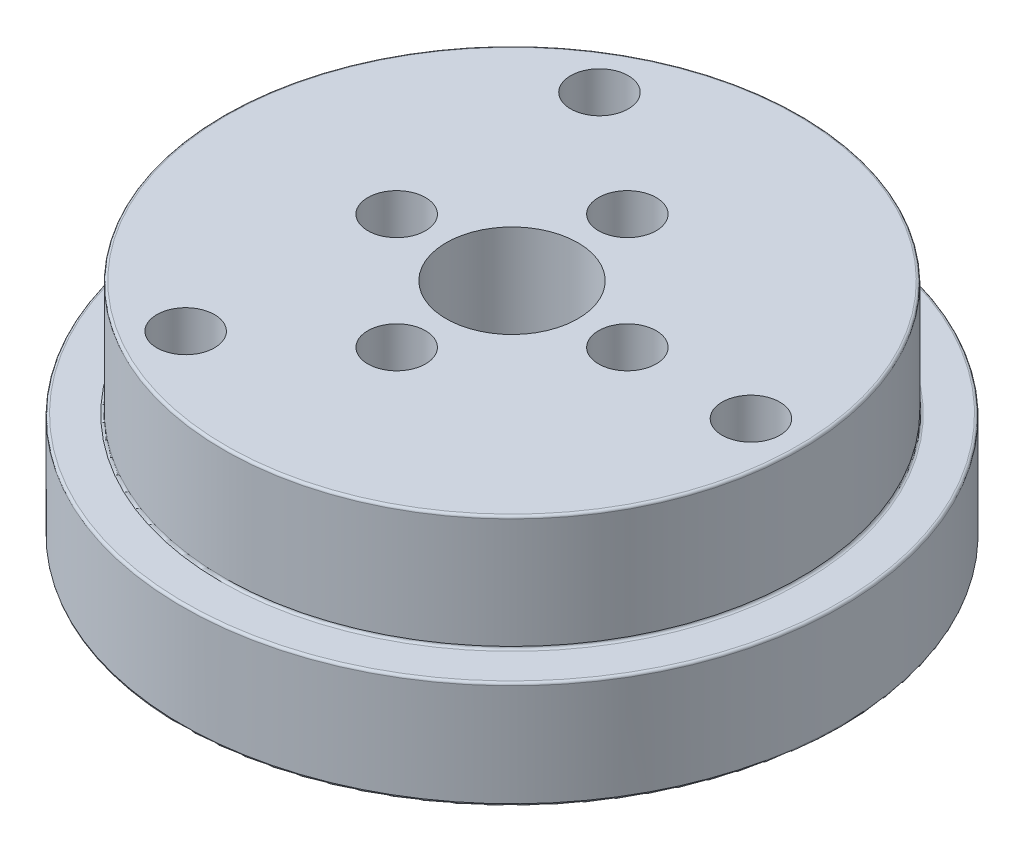
ISO-10303-21;
HEADER;
FILE_DESCRIPTION(('STEP AP214'),'2;1');
FILE_NAME('part.step','',(''),(''),'','','');
FILE_SCHEMA(('AUTOMOTIVE_DESIGN { 1 0 10303 214 1 1 1 1 }'));
ENDSEC;
DATA;
#1=APPLICATION_CONTEXT('core data for automotive mechanical design processes');
#2=APPLICATION_PROTOCOL_DEFINITION('international standard','automotive_design',2000,#1);
#3=PRODUCT_CONTEXT('',#1,'mechanical');
#4=PRODUCT('Part','Part','',(#3));
#5=PRODUCT_RELATED_PRODUCT_CATEGORY('part','',(#4));
#6=PRODUCT_DEFINITION_FORMATION('','',#4);
#7=PRODUCT_DEFINITION_CONTEXT('part definition',#1,'design');
#8=PRODUCT_DEFINITION('design','',#6,#7);
#9=PRODUCT_DEFINITION_SHAPE('','',#8);
#10=(LENGTH_UNIT() NAMED_UNIT(*) SI_UNIT(.MILLI.,.METRE.));
#11=(NAMED_UNIT(*) PLANE_ANGLE_UNIT() SI_UNIT($,.RADIAN.));
#12=(NAMED_UNIT(*) SI_UNIT($,.STERADIAN.) SOLID_ANGLE_UNIT());
#13=UNCERTAINTY_MEASURE_WITH_UNIT(LENGTH_MEASURE(1.E-05),#10,'distance_accuracy_value','');
#14=(GEOMETRIC_REPRESENTATION_CONTEXT(3) GLOBAL_UNCERTAINTY_ASSIGNED_CONTEXT((#13)) GLOBAL_UNIT_ASSIGNED_CONTEXT((#10,
#11,#12)) REPRESENTATION_CONTEXT('',''));
#15=CARTESIAN_POINT('',(0.,0.,0.));
#16=DIRECTION('',(0.,0.,1.));
#17=DIRECTION('',(1.,0.,0.));
#18=AXIS2_PLACEMENT_3D('',#15,#16,#17);
#19=CARTESIAN_POINT('',(0.,13.5,-7.));
#20=DIRECTION('',(0.,-1.,0.));
#21=DIRECTION('',(0.,0.,-1.));
#22=AXIS2_PLACEMENT_3D('',#19,#20,#21);
#23=CYLINDRICAL_SURFACE('',#22,1.75);
#24=CARTESIAN_POINT('',(0.,13.5,-7.));
#25=DIRECTION('',(0.,-1.,0.));
#26=DIRECTION('',(0.,0.,-1.));
#27=AXIS2_PLACEMENT_3D('',#24,#25,#26);
#28=CIRCLE('',#27,1.75);
#29=CARTESIAN_POINT('',(0.,13.5,-8.75));
#30=VERTEX_POINT('',#29);
#31=EDGE_CURVE('E83',#30,#30,#28,.T.);
#32=ORIENTED_EDGE('',*,*,#31,.F.);
#33=EDGE_LOOP('',(#32));
#34=FACE_BOUND('',#33,.T.);
#35=CARTESIAN_POINT('',(0.,7.5,-7.));
#36=DIRECTION('',(0.,-1.,0.));
#37=DIRECTION('',(0.,0.,-1.));
#38=AXIS2_PLACEMENT_3D('',#35,#36,#37);
#39=CIRCLE('',#38,1.75);
#40=CARTESIAN_POINT('',(0.,7.5,-8.75));
#41=VERTEX_POINT('',#40);
#42=EDGE_CURVE('E97',#41,#41,#39,.F.);
#43=ORIENTED_EDGE('',*,*,#42,.F.);
#44=EDGE_LOOP('',(#43));
#45=FACE_BOUND('',#44,.T.);
#46=ADVANCED_FACE('F31',(#34,#45),#23,.F.);
#47=CARTESIAN_POINT('',(7.,13.5,0.));
#48=DIRECTION('',(0.,-1.,0.));
#49=DIRECTION('',(0.,0.,-1.));
#50=AXIS2_PLACEMENT_3D('',#47,#48,#49);
#51=CYLINDRICAL_SURFACE('',#50,1.75);
#52=CARTESIAN_POINT('',(7.,13.5,0.));
#53=DIRECTION('',(0.,-1.,0.));
#54=DIRECTION('',(0.,0.,-1.));
#55=AXIS2_PLACEMENT_3D('',#52,#53,#54);
#56=CIRCLE('',#55,1.75);
#57=CARTESIAN_POINT('',(7.,13.5,-1.75));
#58=VERTEX_POINT('',#57);
#59=EDGE_CURVE('E73',#58,#58,#56,.T.);
#60=ORIENTED_EDGE('',*,*,#59,.F.);
#61=EDGE_LOOP('',(#60));
#62=FACE_BOUND('',#61,.T.);
#63=CARTESIAN_POINT('',(7.,7.5,0.));
#64=DIRECTION('',(0.,-1.,0.));
#65=DIRECTION('',(0.,0.,-1.));
#66=AXIS2_PLACEMENT_3D('',#63,#64,#65);
#67=CIRCLE('',#66,1.75);
#68=CARTESIAN_POINT('',(7.,7.5,-1.75));
#69=VERTEX_POINT('',#68);
#70=EDGE_CURVE('E104',#69,#69,#67,.F.);
#71=ORIENTED_EDGE('',*,*,#70,.F.);
#72=EDGE_LOOP('',(#71));
#73=FACE_BOUND('',#72,.T.);
#74=ADVANCED_FACE('F159',(#62,#73),#51,.F.);
#75=CARTESIAN_POINT('',(0.,13.5,0.));
#76=DIRECTION('',(0.,-1.,0.));
#77=DIRECTION('',(0.,0.,-1.));
#78=AXIS2_PLACEMENT_3D('',#75,#76,#77);
#79=CYLINDRICAL_SURFACE('',#78,4.);
#80=CARTESIAN_POINT('',(0.,13.5,0.));
#81=DIRECTION('',(0.,-1.,0.));
#82=DIRECTION('',(0.,0.,-1.));
#83=AXIS2_PLACEMENT_3D('',#80,#81,#82);
#84=CIRCLE('',#83,4.);
#85=CARTESIAN_POINT('',(0.,13.5,-4.));
#86=VERTEX_POINT('',#85);
#87=EDGE_CURVE('E92',#86,#86,#84,.T.);
#88=ORIENTED_EDGE('',*,*,#87,.F.);
#89=EDGE_LOOP('',(#88));
#90=FACE_BOUND('',#89,.T.);
#91=CARTESIAN_POINT('',(0.,7.5,0.));
#92=DIRECTION('',(0.,-1.,0.));
#93=DIRECTION('',(0.,0.,-1.));
#94=AXIS2_PLACEMENT_3D('',#91,#92,#93);
#95=CIRCLE('',#94,4.);
#96=CARTESIAN_POINT('',(0.,7.5,-4.));
#97=VERTEX_POINT('',#96);
#98=EDGE_CURVE('E107',#97,#97,#95,.F.);
#99=ORIENTED_EDGE('',*,*,#98,.F.);
#100=EDGE_LOOP('',(#99));
#101=FACE_BOUND('',#100,.T.);
#102=ADVANCED_FACE('F165',(#90,#101),#79,.F.);
#103=CARTESIAN_POINT('',(0.,13.5,7.));
#104=DIRECTION('',(0.,-1.,0.));
#105=DIRECTION('',(0.,0.,-1.));
#106=AXIS2_PLACEMENT_3D('',#103,#104,#105);
#107=CYLINDRICAL_SURFACE('',#106,1.75);
#108=CARTESIAN_POINT('',(0.,13.5,7.));
#109=DIRECTION('',(0.,-1.,0.));
#110=DIRECTION('',(0.,0.,-1.));
#111=AXIS2_PLACEMENT_3D('',#108,#109,#110);
#112=CIRCLE('',#111,1.75);
#113=CARTESIAN_POINT('',(0.,13.5,5.25));
#114=VERTEX_POINT('',#113);
#115=EDGE_CURVE('E89',#114,#114,#112,.T.);
#116=ORIENTED_EDGE('',*,*,#115,.F.);
#117=EDGE_LOOP('',(#116));
#118=FACE_BOUND('',#117,.T.);
#119=CARTESIAN_POINT('',(0.,7.5,7.));
#120=DIRECTION('',(0.,-1.,0.));
#121=DIRECTION('',(0.,0.,-1.));
#122=AXIS2_PLACEMENT_3D('',#119,#120,#121);
#123=CIRCLE('',#122,1.75);
#124=CARTESIAN_POINT('',(0.,7.5,5.25));
#125=VERTEX_POINT('',#124);
#126=EDGE_CURVE('E67',#125,#125,#123,.F.);
#127=ORIENTED_EDGE('',*,*,#126,.F.);
#128=EDGE_LOOP('',(#127));
#129=FACE_BOUND('',#128,.T.);
#130=ADVANCED_FACE('F171',(#118,#129),#107,.F.);
#131=CARTESIAN_POINT('',(-7.,13.5,0.));
#132=DIRECTION('',(0.,-1.,0.));
#133=DIRECTION('',(0.,0.,-1.));
#134=AXIS2_PLACEMENT_3D('',#131,#132,#133);
#135=CYLINDRICAL_SURFACE('',#134,1.75);
#136=CARTESIAN_POINT('',(-7.,13.5,0.));
#137=DIRECTION('',(0.,-1.,0.));
#138=DIRECTION('',(0.,0.,-1.));
#139=AXIS2_PLACEMENT_3D('',#136,#137,#138);
#140=CIRCLE('',#139,1.75);
#141=CARTESIAN_POINT('',(-7.,13.5,-1.75));
#142=VERTEX_POINT('',#141);
#143=EDGE_CURVE('E86',#142,#142,#140,.T.);
#144=ORIENTED_EDGE('',*,*,#143,.F.);
#145=EDGE_LOOP('',(#144));
#146=FACE_BOUND('',#145,.T.);
#147=CARTESIAN_POINT('',(-7.,7.5,0.));
#148=DIRECTION('',(0.,-1.,0.));
#149=DIRECTION('',(0.,0.,-1.));
#150=AXIS2_PLACEMENT_3D('',#147,#148,#149);
#151=CIRCLE('',#150,1.75);
#152=CARTESIAN_POINT('',(-7.,7.5,-1.75));
#153=VERTEX_POINT('',#152);
#154=EDGE_CURVE('E64',#153,#153,#151,.F.);
#155=ORIENTED_EDGE('',*,*,#154,.F.);
#156=EDGE_LOOP('',(#155));
#157=FACE_BOUND('',#156,.T.);
#158=ADVANCED_FACE('F132',(#146,#157),#135,.F.);
#159=CARTESIAN_POINT('',(0.,0.,0.));
#160=DIRECTION('',(0.,-1.,0.));
#161=DIRECTION('',(1.,0.,0.));
#162=AXIS2_PLACEMENT_3D('',#159,#160,#161);
#163=PLANE('',#162);
#164=CARTESIAN_POINT('',(0.,0.,0.));
#165=DIRECTION('',(0.,-1.,0.));
#166=DIRECTION('',(1.,0.,0.));
#167=AXIS2_PLACEMENT_3D('',#164,#165,#166);
#168=CIRCLE('',#167,19.85);
#169=CARTESIAN_POINT('',(19.85,0.,0.));
#170=VERTEX_POINT('',#169);
#171=EDGE_CURVE('E54',#170,#170,#168,.T.);
#172=ORIENTED_EDGE('',*,*,#171,.T.);
#173=EDGE_LOOP('',(#172));
#174=FACE_BOUND('',#173,.T.);
#175=CARTESIAN_POINT('',(0.,0.,0.));
#176=DIRECTION('',(0.,-1.,0.));
#177=DIRECTION('',(0.,0.,-1.));
#178=AXIS2_PLACEMENT_3D('',#175,#176,#177);
#179=CIRCLE('',#178,11.);
#180=CARTESIAN_POINT('',(0.,0.,-11.));
#181=VERTEX_POINT('',#180);
#182=EDGE_CURVE('E112',#181,#181,#179,.T.);
#183=ORIENTED_EDGE('',*,*,#182,.F.);
#184=EDGE_LOOP('',(#183));
#185=FACE_BOUND('',#184,.T.);
#186=CARTESIAN_POINT('',(-7.24999999999988,0.,12.5573683548744));
#187=DIRECTION('',(0.,-1.,0.));
#188=DIRECTION('',(0.,0.,-1.));
#189=AXIS2_PLACEMENT_3D('',#186,#187,#188);
#190=CIRCLE('',#189,1.75);
#191=CARTESIAN_POINT('',(-7.24999999999988,0.,10.8073683548744));
#192=VERTEX_POINT('',#191);
#193=EDGE_CURVE('E82',#192,#192,#190,.T.);
#194=ORIENTED_EDGE('',*,*,#193,.F.);
#195=EDGE_LOOP('',(#194));
#196=FACE_BOUND('',#195,.T.);
#197=CARTESIAN_POINT('',(-7.25000000000006,0.,-12.5573683548743));
#198=DIRECTION('',(0.,-1.,0.));
#199=DIRECTION('',(0.,0.,-1.));
#200=AXIS2_PLACEMENT_3D('',#197,#198,#199);
#201=CIRCLE('',#200,1.75);
#202=CARTESIAN_POINT('',(-7.25000000000006,0.,-14.3073683548743));
#203=VERTEX_POINT('',#202);
#204=EDGE_CURVE('E76',#203,#203,#201,.T.);
#205=ORIENTED_EDGE('',*,*,#204,.F.);
#206=EDGE_LOOP('',(#205));
#207=FACE_BOUND('',#206,.T.);
#208=CARTESIAN_POINT('',(14.5,0.,0.));
#209=DIRECTION('',(0.,-1.,0.));
#210=DIRECTION('',(0.,0.,-1.));
#211=AXIS2_PLACEMENT_3D('',#208,#209,#210);
#212=CIRCLE('',#211,1.75);
#213=CARTESIAN_POINT('',(14.5,0.,-1.75));
#214=VERTEX_POINT('',#213);
#215=EDGE_CURVE('E69',#214,#214,#212,.T.);
#216=ORIENTED_EDGE('',*,*,#215,.F.);
#217=EDGE_LOOP('',(#216));
#218=FACE_BOUND('',#217,.T.);
#219=ADVANCED_FACE('F128',(#174,#185,#196,#207,#218),#163,.T.);
#220=CARTESIAN_POINT('',(0.,13.5,0.));
#221=DIRECTION('',(0.,1.,0.));
#222=DIRECTION('',(-1.,0.,0.));
#223=AXIS2_PLACEMENT_3D('',#220,#221,#222);
#224=CYLINDRICAL_SURFACE('',#223,20.);
#225=CARTESIAN_POINT('',(0.,0.149999999999999,0.));
#226=DIRECTION('',(0.,-1.,0.));
#227=DIRECTION('',(1.,0.,0.));
#228=AXIS2_PLACEMENT_3D('',#225,#226,#227);
#229=CIRCLE('',#228,20.);
#230=CARTESIAN_POINT('',(20.,0.149999999999999,0.));
#231=VERTEX_POINT('',#230);
#232=EDGE_CURVE('E57',#231,#231,#229,.F.);
#233=ORIENTED_EDGE('',*,*,#232,.T.);
#234=EDGE_LOOP('',(#233));
#235=FACE_BOUND('',#234,.T.);
#236=CARTESIAN_POINT('',(0.,6.35,0.));
#237=DIRECTION('',(0.,1.,0.));
#238=DIRECTION('',(-1.,0.,0.));
#239=AXIS2_PLACEMENT_3D('',#236,#237,#238);
#240=CIRCLE('',#239,20.);
#241=CARTESIAN_POINT('',(-20.,6.35,0.));
#242=VERTEX_POINT('',#241);
#243=EDGE_CURVE('E60',#242,#242,#240,.F.);
#244=ORIENTED_EDGE('',*,*,#243,.T.);
#245=EDGE_LOOP('',(#244));
#246=FACE_BOUND('',#245,.T.);
#247=ADVANCED_FACE('F131',(#235,#246),#224,.T.);
#248=CARTESIAN_POINT('',(-20.,6.5,0.));
#249=DIRECTION('',(0.,1.,0.));
#250=DIRECTION('',(-1.,0.,0.));
#251=AXIS2_PLACEMENT_3D('',#248,#249,#250);
#252=PLANE('',#251);
#253=CARTESIAN_POINT('',(0.,6.5,0.));
#254=DIRECTION('',(0.,1.,0.));
#255=DIRECTION('',(-1.,0.,0.));
#256=AXIS2_PLACEMENT_3D('',#253,#254,#255);
#257=CIRCLE('',#256,17.65);
#258=CARTESIAN_POINT('',(-17.65,6.5,0.));
#259=VERTEX_POINT('',#258);
#260=EDGE_CURVE('E10',#259,#259,#257,.F.);
#261=ORIENTED_EDGE('',*,*,#260,.T.);
#262=EDGE_LOOP('',(#261));
#263=FACE_BOUND('',#262,.T.);
#264=CARTESIAN_POINT('',(0.,6.5,0.));
#265=DIRECTION('',(0.,1.,0.));
#266=DIRECTION('',(-1.,0.,0.));
#267=AXIS2_PLACEMENT_3D('',#264,#265,#266);
#268=CIRCLE('',#267,19.85);
#269=CARTESIAN_POINT('',(-19.85,6.5,0.));
#270=VERTEX_POINT('',#269);
#271=EDGE_CURVE('E38',#270,#270,#268,.T.);
#272=ORIENTED_EDGE('',*,*,#271,.T.);
#273=EDGE_LOOP('',(#272));
#274=FACE_BOUND('',#273,.T.);
#275=ADVANCED_FACE('F284',(#263,#274),#252,.T.);
#276=CARTESIAN_POINT('',(0.,13.5,0.));
#277=DIRECTION('',(0.,1.,0.));
#278=DIRECTION('',(-1.,0.,0.));
#279=AXIS2_PLACEMENT_3D('',#276,#277,#278);
#280=CYLINDRICAL_SURFACE('',#279,17.5);
#281=CARTESIAN_POINT('',(0.,13.35,0.));
#282=DIRECTION('',(0.,1.,0.));
#283=DIRECTION('',(-1.,0.,0.));
#284=AXIS2_PLACEMENT_3D('',#281,#282,#283);
#285=CIRCLE('',#284,17.5);
#286=CARTESIAN_POINT('',(-17.5,13.35,0.));
#287=VERTEX_POINT('',#286);
#288=EDGE_CURVE('E42',#287,#287,#285,.F.);
#289=ORIENTED_EDGE('',*,*,#288,.T.);
#290=EDGE_LOOP('',(#289));
#291=FACE_BOUND('',#290,.T.);
#292=CARTESIAN_POINT('',(0.,6.65,0.));
#293=DIRECTION('',(0.,1.,0.));
#294=DIRECTION('',(-1.,0.,0.));
#295=AXIS2_PLACEMENT_3D('',#292,#293,#294);
#296=CIRCLE('',#295,17.5);
#297=CARTESIAN_POINT('',(-17.5,6.65,0.));
#298=VERTEX_POINT('',#297);
#299=EDGE_CURVE('E46',#298,#298,#296,.T.);
#300=ORIENTED_EDGE('',*,*,#299,.T.);
#301=EDGE_LOOP('',(#300));
#302=FACE_BOUND('',#301,.T.);
#303=ADVANCED_FACE('F154',(#291,#302),#280,.T.);
#304=CARTESIAN_POINT('',(-17.5,13.5,0.));
#305=DIRECTION('',(0.,1.,0.));
#306=DIRECTION('',(-1.,0.,0.));
#307=AXIS2_PLACEMENT_3D('',#304,#305,#306);
#308=PLANE('',#307);
#309=CARTESIAN_POINT('',(0.,13.5,0.));
#310=DIRECTION('',(0.,1.,0.));
#311=DIRECTION('',(-1.,0.,0.));
#312=AXIS2_PLACEMENT_3D('',#309,#310,#311);
#313=CIRCLE('',#312,17.35);
#314=CARTESIAN_POINT('',(-17.35,13.5,0.));
#315=VERTEX_POINT('',#314);
#316=EDGE_CURVE('E51',#315,#315,#313,.T.);
#317=ORIENTED_EDGE('',*,*,#316,.T.);
#318=EDGE_LOOP('',(#317));
#319=FACE_BOUND('',#318,.T.);
#320=CARTESIAN_POINT('',(-7.24999999999988,13.5,12.5573683548744));
#321=DIRECTION('',(0.,-1.,0.));
#322=DIRECTION('',(0.,0.,-1.));
#323=AXIS2_PLACEMENT_3D('',#320,#321,#322);
#324=CIRCLE('',#323,1.75);
#325=CARTESIAN_POINT('',(-7.24999999999988,13.5,10.8073683548744));
#326=VERTEX_POINT('',#325);
#327=EDGE_CURVE('E63',#326,#326,#324,.T.);
#328=ORIENTED_EDGE('',*,*,#327,.T.);
#329=EDGE_LOOP('',(#328));
#330=FACE_BOUND('',#329,.T.);
#331=ORIENTED_EDGE('',*,*,#143,.T.);
#332=EDGE_LOOP('',(#331));
#333=FACE_BOUND('',#332,.T.);
#334=ORIENTED_EDGE('',*,*,#115,.T.);
#335=EDGE_LOOP('',(#334));
#336=FACE_BOUND('',#335,.T.);
#337=ORIENTED_EDGE('',*,*,#87,.T.);
#338=EDGE_LOOP('',(#337));
#339=FACE_BOUND('',#338,.T.);
#340=CARTESIAN_POINT('',(-7.25000000000006,13.5,-12.5573683548743));
#341=DIRECTION('',(0.,-1.,0.));
#342=DIRECTION('',(0.,0.,-1.));
#343=AXIS2_PLACEMENT_3D('',#340,#341,#342);
#344=CIRCLE('',#343,1.75);
#345=CARTESIAN_POINT('',(-7.25000000000006,13.5,-14.3073683548743));
#346=VERTEX_POINT('',#345);
#347=EDGE_CURVE('E79',#346,#346,#344,.T.);
#348=ORIENTED_EDGE('',*,*,#347,.T.);
#349=EDGE_LOOP('',(#348));
#350=FACE_BOUND('',#349,.T.);
#351=CARTESIAN_POINT('',(14.5,13.5,0.));
#352=DIRECTION('',(0.,-1.,0.));
#353=DIRECTION('',(0.,0.,-1.));
#354=AXIS2_PLACEMENT_3D('',#351,#352,#353);
#355=CIRCLE('',#354,1.75);
#356=CARTESIAN_POINT('',(14.5,13.5,-1.75));
#357=VERTEX_POINT('',#356);
#358=EDGE_CURVE('E72',#357,#357,#355,.T.);
#359=ORIENTED_EDGE('',*,*,#358,.T.);
#360=EDGE_LOOP('',(#359));
#361=FACE_BOUND('',#360,.T.);
#362=ORIENTED_EDGE('',*,*,#59,.T.);
#363=EDGE_LOOP('',(#362));
#364=FACE_BOUND('',#363,.T.);
#365=ORIENTED_EDGE('',*,*,#31,.T.);
#366=EDGE_LOOP('',(#365));
#367=FACE_BOUND('',#366,.T.);
#368=ADVANCED_FACE('F144',(#319,#330,#333,#336,#339,#350,#361,#364,#367),#308,.T.);
#369=CARTESIAN_POINT('',(14.5,13.5,0.));
#370=DIRECTION('',(0.,-1.,0.));
#371=DIRECTION('',(0.,0.,-1.));
#372=AXIS2_PLACEMENT_3D('',#369,#370,#371);
#373=CYLINDRICAL_SURFACE('',#372,1.75);
#374=ORIENTED_EDGE('',*,*,#358,.F.);
#375=EDGE_LOOP('',(#374));
#376=FACE_BOUND('',#375,.T.);
#377=ORIENTED_EDGE('',*,*,#215,.T.);
#378=EDGE_LOOP('',(#377));
#379=FACE_BOUND('',#378,.T.);
#380=ADVANCED_FACE('F141',(#376,#379),#373,.F.);
#381=CARTESIAN_POINT('',(-7.25000000000006,13.5,-12.5573683548743));
#382=DIRECTION('',(0.,-1.,0.));
#383=DIRECTION('',(0.,0.,-1.));
#384=AXIS2_PLACEMENT_3D('',#381,#382,#383);
#385=CYLINDRICAL_SURFACE('',#384,1.75);
#386=ORIENTED_EDGE('',*,*,#347,.F.);
#387=EDGE_LOOP('',(#386));
#388=FACE_BOUND('',#387,.T.);
#389=ORIENTED_EDGE('',*,*,#204,.T.);
#390=EDGE_LOOP('',(#389));
#391=FACE_BOUND('',#390,.T.);
#392=ADVANCED_FACE('F143',(#388,#391),#385,.F.);
#393=CARTESIAN_POINT('',(-7.24999999999988,13.5,12.5573683548744));
#394=DIRECTION('',(0.,-1.,0.));
#395=DIRECTION('',(0.,0.,-1.));
#396=AXIS2_PLACEMENT_3D('',#393,#394,#395);
#397=CYLINDRICAL_SURFACE('',#396,1.75);
#398=ORIENTED_EDGE('',*,*,#327,.F.);
#399=EDGE_LOOP('',(#398));
#400=FACE_BOUND('',#399,.T.);
#401=ORIENTED_EDGE('',*,*,#193,.T.);
#402=EDGE_LOOP('',(#401));
#403=FACE_BOUND('',#402,.T.);
#404=ADVANCED_FACE('F151',(#400,#403),#397,.F.);
#405=CARTESIAN_POINT('',(0.,7.5,0.));
#406=DIRECTION('',(0.,-1.,0.));
#407=DIRECTION('',(0.,0.,-1.));
#408=AXIS2_PLACEMENT_3D('',#405,#406,#407);
#409=PLANE('',#408);
#410=CARTESIAN_POINT('',(0.,7.5,0.));
#411=DIRECTION('',(0.,-1.,0.));
#412=DIRECTION('',(0.,0.,-1.));
#413=AXIS2_PLACEMENT_3D('',#410,#411,#412);
#414=CIRCLE('',#413,11.);
#415=CARTESIAN_POINT('',(0.,7.5,-11.));
#416=VERTEX_POINT('',#415);
#417=EDGE_CURVE('E68',#416,#416,#414,.T.);
#418=ORIENTED_EDGE('',*,*,#417,.T.);
#419=EDGE_LOOP('',(#418));
#420=FACE_BOUND('',#419,.T.);
#421=ORIENTED_EDGE('',*,*,#154,.T.);
#422=EDGE_LOOP('',(#421));
#423=FACE_BOUND('',#422,.T.);
#424=ORIENTED_EDGE('',*,*,#126,.T.);
#425=EDGE_LOOP('',(#424));
#426=FACE_BOUND('',#425,.T.);
#427=ORIENTED_EDGE('',*,*,#98,.T.);
#428=EDGE_LOOP('',(#427));
#429=FACE_BOUND('',#428,.T.);
#430=ORIENTED_EDGE('',*,*,#70,.T.);
#431=EDGE_LOOP('',(#430));
#432=FACE_BOUND('',#431,.T.);
#433=ORIENTED_EDGE('',*,*,#42,.T.);
#434=EDGE_LOOP('',(#433));
#435=FACE_BOUND('',#434,.T.);
#436=ADVANCED_FACE('F118',(#420,#423,#426,#429,#432,#435),#409,.T.);
#437=CARTESIAN_POINT('',(0.,7.5,0.));
#438=DIRECTION('',(0.,-1.,0.));
#439=DIRECTION('',(0.,0.,-1.));
#440=AXIS2_PLACEMENT_3D('',#437,#438,#439);
#441=CYLINDRICAL_SURFACE('',#440,11.);
#442=ORIENTED_EDGE('',*,*,#417,.F.);
#443=EDGE_LOOP('',(#442));
#444=FACE_BOUND('',#443,.T.);
#445=ORIENTED_EDGE('',*,*,#182,.T.);
#446=EDGE_LOOP('',(#445));
#447=FACE_BOUND('',#446,.T.);
#448=ADVANCED_FACE('F121',(#444,#447),#441,.F.);
#449=CARTESIAN_POINT('',(0.,0.149999999999999,0.));
#450=DIRECTION('',(0.,-1.,0.));
#451=DIRECTION('',(1.,0.,0.));
#452=AXIS2_PLACEMENT_3D('',#449,#450,#451);
#453=TOROIDAL_SURFACE('',#452,19.85,0.15);
#454=ORIENTED_EDGE('',*,*,#171,.F.);
#455=EDGE_LOOP('',(#454));
#456=FACE_BOUND('',#455,.T.);
#457=ORIENTED_EDGE('',*,*,#232,.F.);
#458=EDGE_LOOP('',(#457));
#459=FACE_BOUND('',#458,.T.);
#460=ADVANCED_FACE('F124',(#456,#459),#453,.T.);
#461=CARTESIAN_POINT('',(0.,13.35,0.));
#462=DIRECTION('',(0.,1.,0.));
#463=DIRECTION('',(-1.,0.,0.));
#464=AXIS2_PLACEMENT_3D('',#461,#462,#463);
#465=TOROIDAL_SURFACE('',#464,17.35,0.15);
#466=ORIENTED_EDGE('',*,*,#288,.F.);
#467=EDGE_LOOP('',(#466));
#468=FACE_BOUND('',#467,.T.);
#469=ORIENTED_EDGE('',*,*,#316,.F.);
#470=EDGE_LOOP('',(#469));
#471=FACE_BOUND('',#470,.T.);
#472=ADVANCED_FACE('F201',(#468,#471),#465,.T.);
#473=CARTESIAN_POINT('',(0.,6.65,0.));
#474=DIRECTION('',(0.,1.,0.));
#475=DIRECTION('',(-1.,0.,0.));
#476=AXIS2_PLACEMENT_3D('',#473,#474,#475);
#477=TOROIDAL_SURFACE('',#476,17.65,0.15);
#478=ORIENTED_EDGE('',*,*,#260,.F.);
#479=EDGE_LOOP('',(#478));
#480=FACE_BOUND('',#479,.T.);
#481=ORIENTED_EDGE('',*,*,#299,.F.);
#482=EDGE_LOOP('',(#481));
#483=FACE_BOUND('',#482,.T.);
#484=ADVANCED_FACE('F210',(#480,#483),#477,.F.);
#485=CARTESIAN_POINT('',(0.,6.35,0.));
#486=DIRECTION('',(0.,1.,0.));
#487=DIRECTION('',(-1.,0.,0.));
#488=AXIS2_PLACEMENT_3D('',#485,#486,#487);
#489=TOROIDAL_SURFACE('',#488,19.85,0.15);
#490=ORIENTED_EDGE('',*,*,#243,.F.);
#491=EDGE_LOOP('',(#490));
#492=FACE_BOUND('',#491,.T.);
#493=ORIENTED_EDGE('',*,*,#271,.F.);
#494=EDGE_LOOP('',(#493));
#495=FACE_BOUND('',#494,.T.);
#496=ADVANCED_FACE('F33',(#492,#495),#489,.T.);
#497=CLOSED_SHELL('',(#46,#74,#102,#130,#158,#219,#247,#275,#303,#368,#380,#392,#404,#436,#448,
#460,#472,#484,#496));
#498=MANIFOLD_SOLID_BREP('B2',#497);
#499=ADVANCED_BREP_SHAPE_REPRESENTATION('',(#18,#498),#14);
#500=SHAPE_DEFINITION_REPRESENTATION(#9,#499);
ENDSEC;
END-ISO-10303-21;
